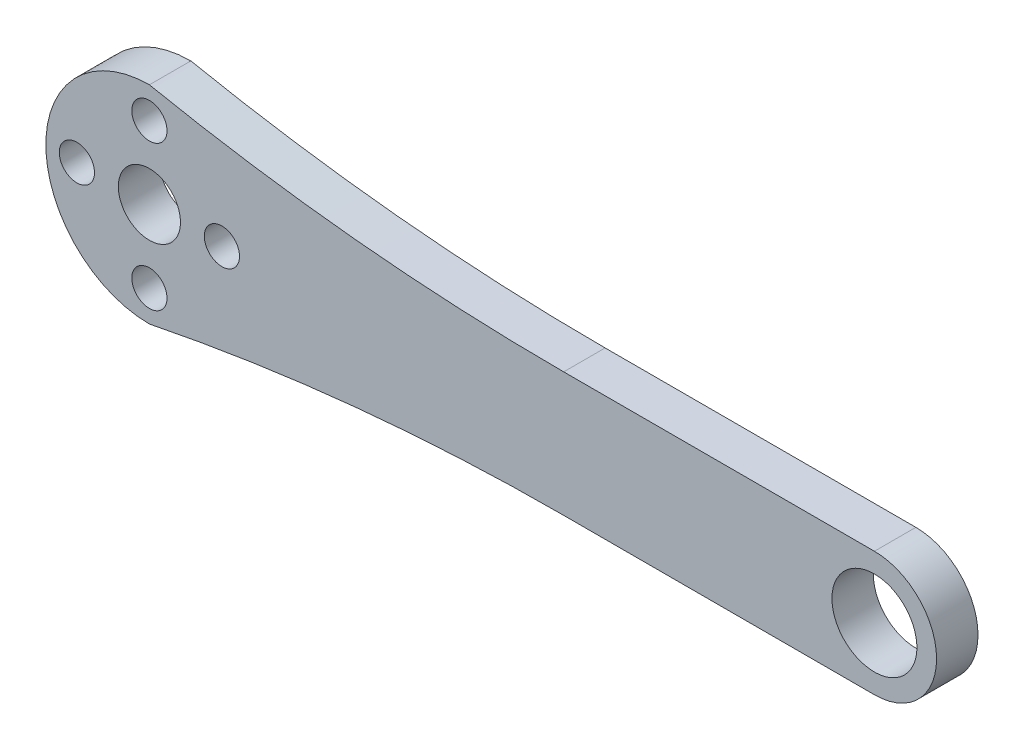
ISO-10303-21;
HEADER;
FILE_DESCRIPTION(('STEP AP214'),'2;1');
FILE_NAME('part.step','',(''),(''),'','','');
FILE_SCHEMA(('AUTOMOTIVE_DESIGN { 1 0 10303 214 1 1 1 1 }'));
ENDSEC;
DATA;
#1=APPLICATION_CONTEXT('core data for automotive mechanical design processes');
#2=APPLICATION_PROTOCOL_DEFINITION('international standard','automotive_design',2000,#1);
#3=PRODUCT_CONTEXT('',#1,'mechanical');
#4=PRODUCT('Part','Part','',(#3));
#5=PRODUCT_RELATED_PRODUCT_CATEGORY('part','',(#4));
#6=PRODUCT_DEFINITION_FORMATION('','',#4);
#7=PRODUCT_DEFINITION_CONTEXT('part definition',#1,'design');
#8=PRODUCT_DEFINITION('design','',#6,#7);
#9=PRODUCT_DEFINITION_SHAPE('','',#8);
#10=(LENGTH_UNIT() NAMED_UNIT(*) SI_UNIT(.MILLI.,.METRE.));
#11=(NAMED_UNIT(*) PLANE_ANGLE_UNIT() SI_UNIT($,.RADIAN.));
#12=(NAMED_UNIT(*) SI_UNIT($,.STERADIAN.) SOLID_ANGLE_UNIT());
#13=UNCERTAINTY_MEASURE_WITH_UNIT(LENGTH_MEASURE(1.E-05),#10,'distance_accuracy_value','');
#14=(GEOMETRIC_REPRESENTATION_CONTEXT(3) GLOBAL_UNCERTAINTY_ASSIGNED_CONTEXT((#13)) GLOBAL_UNIT_ASSIGNED_CONTEXT((#10,
#11,#12)) REPRESENTATION_CONTEXT('',''));
#15=CARTESIAN_POINT('',(0.,0.,0.));
#16=DIRECTION('',(0.,0.,1.));
#17=DIRECTION('',(1.,0.,0.));
#18=AXIS2_PLACEMENT_3D('',#15,#16,#17);
#19=CARTESIAN_POINT('',(39.9999988472975,208.000000232867,0.));
#20=DIRECTION('',(0.,0.,1.));
#21=DIRECTION('',(1.,0.,0.));
#22=AXIS2_PLACEMENT_3D('',#19,#20,#21);
#23=CYLINDRICAL_SURFACE('',#22,201.999999999998);
#24=CARTESIAN_POINT('',(39.9999988472975,208.000000232867,4.));
#25=DIRECTION('',(0.,0.,-1.));
#26=DIRECTION('',(-1.,0.,0.));
#27=AXIS2_PLACEMENT_3D('',#24,#25,#26);
#28=CIRCLE('',#27,201.999999999998);
#29=CARTESIAN_POINT('',(39.9999988472975,6.00000023286912,4.));
#30=VERTEX_POINT('',#29);
#31=CARTESIAN_POINT('',(2.88175844853124E-06,9.99999941782659,4.));
#32=VERTEX_POINT('',#31);
#33=EDGE_CURVE('E120',#30,#32,#28,.T.);
#34=ORIENTED_EDGE('',*,*,#33,.F.);
#35=DIRECTION('',(0.,0.,1.));
#36=VECTOR('',#35,1.);
#37=CARTESIAN_POINT('',(39.9999988472975,6.00000023286912,0.));
#38=LINE('',#37,#36);
#39=CARTESIAN_POINT('',(39.9999988472975,6.00000023286912,0.));
#40=VERTEX_POINT('',#39);
#41=EDGE_CURVE('E11',#40,#30,#38,.T.);
#42=ORIENTED_EDGE('',*,*,#41,.F.);
#43=CARTESIAN_POINT('',(39.9999988472975,208.000000232867,0.));
#44=DIRECTION('',(0.,0.,-1.));
#45=DIRECTION('',(-1.,0.,0.));
#46=AXIS2_PLACEMENT_3D('',#43,#44,#45);
#47=CIRCLE('',#46,201.999999999998);
#48=CARTESIAN_POINT('',(2.88175844853124E-06,9.99999941782659,0.));
#49=VERTEX_POINT('',#48);
#50=EDGE_CURVE('E135',#40,#49,#47,.T.);
#51=ORIENTED_EDGE('',*,*,#50,.T.);
#52=DIRECTION('',(0.,0.,1.));
#53=VECTOR('',#52,1.);
#54=CARTESIAN_POINT('',(2.88175844853124E-06,9.99999941782659,0.));
#55=LINE('',#54,#53);
#56=EDGE_CURVE('E38',#49,#32,#55,.T.);
#57=ORIENTED_EDGE('',*,*,#56,.T.);
#58=EDGE_LOOP('',(#34,#42,#51,#57));
#59=FACE_BOUND('',#58,.T.);
#60=ADVANCED_FACE('F35',(#59),#23,.F.);
#61=CARTESIAN_POINT('',(70.,6.00000023286913,0.));
#62=DIRECTION('',(0.,1.,0.));
#63=DIRECTION('',(-1.,0.,0.));
#64=AXIS2_PLACEMENT_3D('',#61,#62,#63);
#65=PLANE('',#64);
#66=DIRECTION('',(-1.,0.,0.));
#67=VECTOR('',#66,1.);
#68=CARTESIAN_POINT('',(70.,6.00000023286913,4.));
#69=LINE('',#68,#67);
#70=CARTESIAN_POINT('',(70.,6.00000023286913,4.));
#71=VERTEX_POINT('',#70);
#72=EDGE_CURVE('E133',#71,#30,#69,.T.);
#73=ORIENTED_EDGE('',*,*,#72,.F.);
#74=DIRECTION('',(0.,0.,1.));
#75=VECTOR('',#74,1.);
#76=CARTESIAN_POINT('',(70.,6.00000023286913,0.));
#77=LINE('',#76,#75);
#78=CARTESIAN_POINT('',(70.,6.00000023286913,0.));
#79=VERTEX_POINT('',#78);
#80=EDGE_CURVE('E44',#79,#71,#77,.T.);
#81=ORIENTED_EDGE('',*,*,#80,.F.);
#82=DIRECTION('',(-1.,0.,0.));
#83=VECTOR('',#82,1.);
#84=CARTESIAN_POINT('',(70.,6.00000023286913,0.));
#85=LINE('',#84,#83);
#86=EDGE_CURVE('E110',#79,#40,#85,.T.);
#87=ORIENTED_EDGE('',*,*,#86,.T.);
#88=ORIENTED_EDGE('',*,*,#41,.T.);
#89=EDGE_LOOP('',(#73,#81,#87,#88));
#90=FACE_BOUND('',#89,.T.);
#91=ADVANCED_FACE('F143',(#90),#65,.T.);
#92=CARTESIAN_POINT('',(70.,1.16434535710891E-07,0.));
#93=DIRECTION('',(0.,0.,1.));
#94=DIRECTION('',(1.,0.,0.));
#95=AXIS2_PLACEMENT_3D('',#92,#93,#94);
#96=CYLINDRICAL_SURFACE('',#95,6.00000011643459);
#97=CARTESIAN_POINT('',(70.,1.16434535710891E-07,4.));
#98=DIRECTION('',(0.,0.,1.));
#99=DIRECTION('',(1.,0.,0.));
#100=AXIS2_PLACEMENT_3D('',#97,#98,#99);
#101=CIRCLE('',#100,6.00000011643459);
#102=CARTESIAN_POINT('',(70.,-6.00000000000006,4.));
#103=VERTEX_POINT('',#102);
#104=EDGE_CURVE('E97',#103,#71,#101,.T.);
#105=ORIENTED_EDGE('',*,*,#104,.F.);
#106=DIRECTION('',(0.,0.,1.));
#107=VECTOR('',#106,1.);
#108=CARTESIAN_POINT('',(70.,-6.00000000000006,0.));
#109=LINE('',#108,#107);
#110=CARTESIAN_POINT('',(70.,-6.00000000000006,0.));
#111=VERTEX_POINT('',#110);
#112=EDGE_CURVE('E92',#111,#103,#109,.T.);
#113=ORIENTED_EDGE('',*,*,#112,.F.);
#114=CARTESIAN_POINT('',(70.,1.16434535710891E-07,0.));
#115=DIRECTION('',(0.,0.,1.));
#116=DIRECTION('',(1.,0.,0.));
#117=AXIS2_PLACEMENT_3D('',#114,#115,#116);
#118=CIRCLE('',#117,6.00000011643459);
#119=EDGE_CURVE('E95',#111,#79,#118,.T.);
#120=ORIENTED_EDGE('',*,*,#119,.T.);
#121=ORIENTED_EDGE('',*,*,#80,.T.);
#122=EDGE_LOOP('',(#105,#113,#120,#121));
#123=FACE_BOUND('',#122,.T.);
#124=ADVANCED_FACE('F94',(#123),#96,.T.);
#125=CARTESIAN_POINT('',(40.,-6.00000000000006,0.));
#126=DIRECTION('',(0.,-1.,0.));
#127=DIRECTION('',(0.,0.,-1.));
#128=AXIS2_PLACEMENT_3D('',#125,#126,#127);
#129=PLANE('',#128);
#130=DIRECTION('',(1.,0.,0.));
#131=VECTOR('',#130,1.);
#132=CARTESIAN_POINT('',(40.,-6.00000000000006,4.));
#133=LINE('',#132,#131);
#134=CARTESIAN_POINT('',(40.,-6.00000000000006,4.));
#135=VERTEX_POINT('',#134);
#136=EDGE_CURVE('E130',#135,#103,#133,.T.);
#137=ORIENTED_EDGE('',*,*,#136,.F.);
#138=DIRECTION('',(0.,0.,1.));
#139=VECTOR('',#138,1.);
#140=CARTESIAN_POINT('',(40.,-6.00000000000006,0.));
#141=LINE('',#140,#139);
#142=CARTESIAN_POINT('',(40.,-6.00000000000006,0.));
#143=VERTEX_POINT('',#142);
#144=EDGE_CURVE('E102',#143,#135,#141,.T.);
#145=ORIENTED_EDGE('',*,*,#144,.F.);
#146=DIRECTION('',(1.,0.,0.));
#147=VECTOR('',#146,1.);
#148=CARTESIAN_POINT('',(40.,-6.00000000000006,0.));
#149=LINE('',#148,#147);
#150=EDGE_CURVE('E108',#143,#111,#149,.T.);
#151=ORIENTED_EDGE('',*,*,#150,.T.);
#152=ORIENTED_EDGE('',*,*,#112,.T.);
#153=EDGE_LOOP('',(#137,#145,#151,#152));
#154=FACE_BOUND('',#153,.T.);
#155=ADVANCED_FACE('F112',(#154),#129,.T.);
#156=CARTESIAN_POINT('',(40.,-208.000000000003,0.));
#157=DIRECTION('',(0.,0.,1.));
#158=DIRECTION('',(1.,0.,0.));
#159=AXIS2_PLACEMENT_3D('',#156,#157,#158);
#160=CYLINDRICAL_SURFACE('',#159,202.000000000003);
#161=CARTESIAN_POINT('',(40.,-208.000000000003,4.));
#162=DIRECTION('',(0.,0.,-1.));
#163=DIRECTION('',(-1.,0.,0.));
#164=AXIS2_PLACEMENT_3D('',#161,#162,#163);
#165=CIRCLE('',#164,202.000000000003);
#166=CARTESIAN_POINT('',(0.,-10.,4.));
#167=VERTEX_POINT('',#166);
#168=EDGE_CURVE('E127',#167,#135,#165,.T.);
#169=ORIENTED_EDGE('',*,*,#168,.F.);
#170=DIRECTION('',(0.,0.,1.));
#171=VECTOR('',#170,1.);
#172=CARTESIAN_POINT('',(0.,-10.,0.));
#173=LINE('',#172,#171);
#174=CARTESIAN_POINT('',(0.,-10.,0.));
#175=VERTEX_POINT('',#174);
#176=EDGE_CURVE('E138',#175,#167,#173,.T.);
#177=ORIENTED_EDGE('',*,*,#176,.F.);
#178=CARTESIAN_POINT('',(40.,-208.000000000003,0.));
#179=DIRECTION('',(0.,0.,-1.));
#180=DIRECTION('',(-1.,0.,0.));
#181=AXIS2_PLACEMENT_3D('',#178,#179,#180);
#182=CIRCLE('',#181,202.000000000003);
#183=EDGE_CURVE('E113',#175,#143,#182,.T.);
#184=ORIENTED_EDGE('',*,*,#183,.T.);
#185=ORIENTED_EDGE('',*,*,#144,.T.);
#186=EDGE_LOOP('',(#169,#177,#184,#185));
#187=FACE_BOUND('',#186,.T.);
#188=ADVANCED_FACE('F156',(#187),#160,.F.);
#189=CARTESIAN_POINT('',(0.,-2.91086498654947E-07,0.));
#190=DIRECTION('',(0.,0.,1.));
#191=DIRECTION('',(1.,0.,0.));
#192=AXIS2_PLACEMENT_3D('',#189,#190,#191);
#193=CYLINDRICAL_SURFACE('',#192,9.9999997089135);
#194=CARTESIAN_POINT('',(0.,-2.91086498654947E-07,4.));
#195=DIRECTION('',(0.,0.,1.));
#196=DIRECTION('',(1.,0.,0.));
#197=AXIS2_PLACEMENT_3D('',#194,#195,#196);
#198=CIRCLE('',#197,9.9999997089135);
#199=EDGE_CURVE('E123',#32,#167,#198,.T.);
#200=ORIENTED_EDGE('',*,*,#199,.F.);
#201=ORIENTED_EDGE('',*,*,#56,.F.);
#202=CARTESIAN_POINT('',(0.,-2.91086498654947E-07,0.));
#203=DIRECTION('',(0.,0.,1.));
#204=DIRECTION('',(1.,0.,0.));
#205=AXIS2_PLACEMENT_3D('',#202,#203,#204);
#206=CIRCLE('',#205,9.9999997089135);
#207=EDGE_CURVE('E115',#49,#175,#206,.T.);
#208=ORIENTED_EDGE('',*,*,#207,.T.);
#209=ORIENTED_EDGE('',*,*,#176,.T.);
#210=EDGE_LOOP('',(#200,#201,#208,#209));
#211=FACE_BOUND('',#210,.T.);
#212=ADVANCED_FACE('F140',(#211),#193,.T.);
#213=CARTESIAN_POINT('',(39.9999988472975,208.000000232867,0.));
#214=DIRECTION('',(0.,0.,-1.));
#215=DIRECTION('',(-1.,0.,0.));
#216=AXIS2_PLACEMENT_3D('',#213,#214,#215);
#217=PLANE('',#216);
#218=CARTESIAN_POINT('',(70.,1.16434535710891E-07,0.));
#219=DIRECTION('',(0.,0.,1.));
#220=DIRECTION('',(-1.,0.,0.));
#221=AXIS2_PLACEMENT_3D('',#218,#219,#220);
#222=CIRCLE('',#221,4.09999999999999);
#223=CARTESIAN_POINT('',(65.9,1.16434535710891E-07,0.));
#224=VERTEX_POINT('',#223);
#225=EDGE_CURVE('E198',#224,#224,#222,.T.);
#226=ORIENTED_EDGE('',*,*,#225,.T.);
#227=EDGE_LOOP('',(#226));
#228=FACE_BOUND('',#227,.T.);
#229=CARTESIAN_POINT('',(7.,0.,0.));
#230=DIRECTION('',(0.,0.,1.));
#231=DIRECTION('',(-1.,0.,0.));
#232=AXIS2_PLACEMENT_3D('',#229,#230,#231);
#233=CIRCLE('',#232,1.7);
#234=CARTESIAN_POINT('',(5.3,0.,0.));
#235=VERTEX_POINT('',#234);
#236=EDGE_CURVE('E206',#235,#235,#233,.T.);
#237=ORIENTED_EDGE('',*,*,#236,.T.);
#238=EDGE_LOOP('',(#237));
#239=FACE_BOUND('',#238,.T.);
#240=CARTESIAN_POINT('',(0.,-7.,0.));
#241=DIRECTION('',(0.,0.,1.));
#242=DIRECTION('',(-1.,0.,0.));
#243=AXIS2_PLACEMENT_3D('',#240,#241,#242);
#244=CIRCLE('',#243,1.7);
#245=CARTESIAN_POINT('',(-1.7,-7.,0.));
#246=VERTEX_POINT('',#245);
#247=EDGE_CURVE('E212',#246,#246,#244,.T.);
#248=ORIENTED_EDGE('',*,*,#247,.T.);
#249=EDGE_LOOP('',(#248));
#250=FACE_BOUND('',#249,.T.);
#251=CARTESIAN_POINT('',(-7.,0.,0.));
#252=DIRECTION('',(0.,0.,1.));
#253=DIRECTION('',(-1.,0.,0.));
#254=AXIS2_PLACEMENT_3D('',#251,#252,#253);
#255=CIRCLE('',#254,1.7);
#256=CARTESIAN_POINT('',(-8.7,0.,0.));
#257=VERTEX_POINT('',#256);
#258=EDGE_CURVE('E218',#257,#257,#255,.T.);
#259=ORIENTED_EDGE('',*,*,#258,.T.);
#260=EDGE_LOOP('',(#259));
#261=FACE_BOUND('',#260,.T.);
#262=CARTESIAN_POINT('',(0.,-2.91086498654947E-07,0.));
#263=DIRECTION('',(0.,0.,1.));
#264=DIRECTION('',(-1.,0.,0.));
#265=AXIS2_PLACEMENT_3D('',#262,#263,#264);
#266=CIRCLE('',#265,3.00000000000001);
#267=CARTESIAN_POINT('',(-3.00000000000001,-2.91086498654947E-07,0.));
#268=VERTEX_POINT('',#267);
#269=EDGE_CURVE('E224',#268,#268,#266,.T.);
#270=ORIENTED_EDGE('',*,*,#269,.T.);
#271=EDGE_LOOP('',(#270));
#272=FACE_BOUND('',#271,.T.);
#273=CARTESIAN_POINT('',(0.,7.,0.));
#274=DIRECTION('',(0.,0.,1.));
#275=DIRECTION('',(-1.,0.,0.));
#276=AXIS2_PLACEMENT_3D('',#273,#274,#275);
#277=CIRCLE('',#276,1.7);
#278=CARTESIAN_POINT('',(-1.7,7.,0.));
#279=VERTEX_POINT('',#278);
#280=EDGE_CURVE('E124',#279,#279,#277,.T.);
#281=ORIENTED_EDGE('',*,*,#280,.T.);
#282=EDGE_LOOP('',(#281));
#283=FACE_BOUND('',#282,.T.);
#284=ORIENTED_EDGE('',*,*,#50,.F.);
#285=ORIENTED_EDGE('',*,*,#86,.F.);
#286=ORIENTED_EDGE('',*,*,#119,.F.);
#287=ORIENTED_EDGE('',*,*,#150,.F.);
#288=ORIENTED_EDGE('',*,*,#183,.F.);
#289=ORIENTED_EDGE('',*,*,#207,.F.);
#290=EDGE_LOOP('',(#284,#285,#286,#287,#288,#289));
#291=FACE_BOUND('',#290,.T.);
#292=ADVANCED_FACE('F106',(#228,#239,#250,#261,#272,#283,#291),#217,.T.);
#293=CARTESIAN_POINT('',(39.9999988472975,208.000000232867,4.));
#294=DIRECTION('',(0.,0.,-1.));
#295=DIRECTION('',(-1.,0.,0.));
#296=AXIS2_PLACEMENT_3D('',#293,#294,#295);
#297=PLANE('',#296);
#298=CARTESIAN_POINT('',(70.,1.16434535710891E-07,4.));
#299=DIRECTION('',(0.,0.,1.));
#300=DIRECTION('',(-1.,0.,0.));
#301=AXIS2_PLACEMENT_3D('',#298,#299,#300);
#302=CIRCLE('',#301,4.09999999999999);
#303=CARTESIAN_POINT('',(65.9,1.16434535710891E-07,4.));
#304=VERTEX_POINT('',#303);
#305=EDGE_CURVE('E201',#304,#304,#302,.T.);
#306=ORIENTED_EDGE('',*,*,#305,.F.);
#307=EDGE_LOOP('',(#306));
#308=FACE_BOUND('',#307,.T.);
#309=CARTESIAN_POINT('',(7.,0.,4.));
#310=DIRECTION('',(0.,0.,1.));
#311=DIRECTION('',(-1.,0.,0.));
#312=AXIS2_PLACEMENT_3D('',#309,#310,#311);
#313=CIRCLE('',#312,1.7);
#314=CARTESIAN_POINT('',(5.3,0.,4.));
#315=VERTEX_POINT('',#314);
#316=EDGE_CURVE('E203',#315,#315,#313,.T.);
#317=ORIENTED_EDGE('',*,*,#316,.F.);
#318=EDGE_LOOP('',(#317));
#319=FACE_BOUND('',#318,.T.);
#320=CARTESIAN_POINT('',(0.,-7.,4.));
#321=DIRECTION('',(0.,0.,1.));
#322=DIRECTION('',(-1.,0.,0.));
#323=AXIS2_PLACEMENT_3D('',#320,#321,#322);
#324=CIRCLE('',#323,1.7);
#325=CARTESIAN_POINT('',(-1.7,-7.,4.));
#326=VERTEX_POINT('',#325);
#327=EDGE_CURVE('E209',#326,#326,#324,.T.);
#328=ORIENTED_EDGE('',*,*,#327,.F.);
#329=EDGE_LOOP('',(#328));
#330=FACE_BOUND('',#329,.T.);
#331=CARTESIAN_POINT('',(-7.,0.,4.));
#332=DIRECTION('',(0.,0.,1.));
#333=DIRECTION('',(-1.,0.,0.));
#334=AXIS2_PLACEMENT_3D('',#331,#332,#333);
#335=CIRCLE('',#334,1.7);
#336=CARTESIAN_POINT('',(-8.7,0.,4.));
#337=VERTEX_POINT('',#336);
#338=EDGE_CURVE('E215',#337,#337,#335,.T.);
#339=ORIENTED_EDGE('',*,*,#338,.F.);
#340=EDGE_LOOP('',(#339));
#341=FACE_BOUND('',#340,.T.);
#342=CARTESIAN_POINT('',(0.,-2.91086498654947E-07,4.));
#343=DIRECTION('',(0.,0.,1.));
#344=DIRECTION('',(-1.,0.,0.));
#345=AXIS2_PLACEMENT_3D('',#342,#343,#344);
#346=CIRCLE('',#345,3.00000000000001);
#347=CARTESIAN_POINT('',(-3.00000000000001,-2.91086498654947E-07,4.));
#348=VERTEX_POINT('',#347);
#349=EDGE_CURVE('E221',#348,#348,#346,.T.);
#350=ORIENTED_EDGE('',*,*,#349,.F.);
#351=EDGE_LOOP('',(#350));
#352=FACE_BOUND('',#351,.T.);
#353=CARTESIAN_POINT('',(0.,7.,4.));
#354=DIRECTION('',(0.,0.,1.));
#355=DIRECTION('',(-1.,0.,0.));
#356=AXIS2_PLACEMENT_3D('',#353,#354,#355);
#357=CIRCLE('',#356,1.7);
#358=CARTESIAN_POINT('',(-1.7,7.,4.));
#359=VERTEX_POINT('',#358);
#360=EDGE_CURVE('E227',#359,#359,#357,.T.);
#361=ORIENTED_EDGE('',*,*,#360,.F.);
#362=EDGE_LOOP('',(#361));
#363=FACE_BOUND('',#362,.T.);
#364=ORIENTED_EDGE('',*,*,#33,.T.);
#365=ORIENTED_EDGE('',*,*,#199,.T.);
#366=ORIENTED_EDGE('',*,*,#168,.T.);
#367=ORIENTED_EDGE('',*,*,#136,.T.);
#368=ORIENTED_EDGE('',*,*,#104,.T.);
#369=ORIENTED_EDGE('',*,*,#72,.T.);
#370=EDGE_LOOP('',(#364,#365,#366,#367,#368,#369));
#371=FACE_BOUND('',#370,.T.);
#372=ADVANCED_FACE('F142',(#308,#319,#330,#341,#352,#363,#371),#297,.F.);
#373=CARTESIAN_POINT('',(0.,7.,0.));
#374=DIRECTION('',(0.,0.,1.));
#375=DIRECTION('',(1.,0.,0.));
#376=AXIS2_PLACEMENT_3D('',#373,#374,#375);
#377=CYLINDRICAL_SURFACE('',#376,1.7);
#378=ORIENTED_EDGE('',*,*,#280,.F.);
#379=EDGE_LOOP('',(#378));
#380=FACE_BOUND('',#379,.T.);
#381=ORIENTED_EDGE('',*,*,#360,.T.);
#382=EDGE_LOOP('',(#381));
#383=FACE_BOUND('',#382,.T.);
#384=ADVANCED_FACE('F167',(#380,#383),#377,.F.);
#385=CARTESIAN_POINT('',(0.,-2.91086498654947E-07,0.));
#386=DIRECTION('',(0.,0.,1.));
#387=DIRECTION('',(1.,0.,0.));
#388=AXIS2_PLACEMENT_3D('',#385,#386,#387);
#389=CYLINDRICAL_SURFACE('',#388,3.00000000000001);
#390=ORIENTED_EDGE('',*,*,#269,.F.);
#391=EDGE_LOOP('',(#390));
#392=FACE_BOUND('',#391,.T.);
#393=ORIENTED_EDGE('',*,*,#349,.T.);
#394=EDGE_LOOP('',(#393));
#395=FACE_BOUND('',#394,.T.);
#396=ADVANCED_FACE('F174',(#392,#395),#389,.F.);
#397=CARTESIAN_POINT('',(-7.,0.,0.));
#398=DIRECTION('',(0.,0.,1.));
#399=DIRECTION('',(1.,0.,0.));
#400=AXIS2_PLACEMENT_3D('',#397,#398,#399);
#401=CYLINDRICAL_SURFACE('',#400,1.7);
#402=ORIENTED_EDGE('',*,*,#258,.F.);
#403=EDGE_LOOP('',(#402));
#404=FACE_BOUND('',#403,.T.);
#405=ORIENTED_EDGE('',*,*,#338,.T.);
#406=EDGE_LOOP('',(#405));
#407=FACE_BOUND('',#406,.T.);
#408=ADVANCED_FACE('F178',(#404,#407),#401,.F.);
#409=CARTESIAN_POINT('',(0.,-7.,0.));
#410=DIRECTION('',(0.,0.,1.));
#411=DIRECTION('',(1.,0.,0.));
#412=AXIS2_PLACEMENT_3D('',#409,#410,#411);
#413=CYLINDRICAL_SURFACE('',#412,1.7);
#414=ORIENTED_EDGE('',*,*,#247,.F.);
#415=EDGE_LOOP('',(#414));
#416=FACE_BOUND('',#415,.T.);
#417=ORIENTED_EDGE('',*,*,#327,.T.);
#418=EDGE_LOOP('',(#417));
#419=FACE_BOUND('',#418,.T.);
#420=ADVANCED_FACE('F182',(#416,#419),#413,.F.);
#421=CARTESIAN_POINT('',(7.,0.,0.));
#422=DIRECTION('',(0.,0.,1.));
#423=DIRECTION('',(1.,0.,0.));
#424=AXIS2_PLACEMENT_3D('',#421,#422,#423);
#425=CYLINDRICAL_SURFACE('',#424,1.7);
#426=ORIENTED_EDGE('',*,*,#236,.F.);
#427=EDGE_LOOP('',(#426));
#428=FACE_BOUND('',#427,.T.);
#429=ORIENTED_EDGE('',*,*,#316,.T.);
#430=EDGE_LOOP('',(#429));
#431=FACE_BOUND('',#430,.T.);
#432=ADVANCED_FACE('F186',(#428,#431),#425,.F.);
#433=CARTESIAN_POINT('',(70.,1.16434535710891E-07,0.));
#434=DIRECTION('',(0.,0.,1.));
#435=DIRECTION('',(1.,0.,0.));
#436=AXIS2_PLACEMENT_3D('',#433,#434,#435);
#437=CYLINDRICAL_SURFACE('',#436,4.09999999999999);
#438=ORIENTED_EDGE('',*,*,#225,.F.);
#439=EDGE_LOOP('',(#438));
#440=FACE_BOUND('',#439,.T.);
#441=ORIENTED_EDGE('',*,*,#305,.T.);
#442=EDGE_LOOP('',(#441));
#443=FACE_BOUND('',#442,.T.);
#444=ADVANCED_FACE('F190',(#440,#443),#437,.F.);
#445=CLOSED_SHELL('',(#60,#91,#124,#155,#188,#212,#292,#372,#384,#396,#408,#420,#432,#444));
#446=MANIFOLD_SOLID_BREP('B2',#445);
#447=ADVANCED_BREP_SHAPE_REPRESENTATION('',(#18,#446),#14);
#448=SHAPE_DEFINITION_REPRESENTATION(#9,#447);
ENDSEC;
END-ISO-10303-21;
